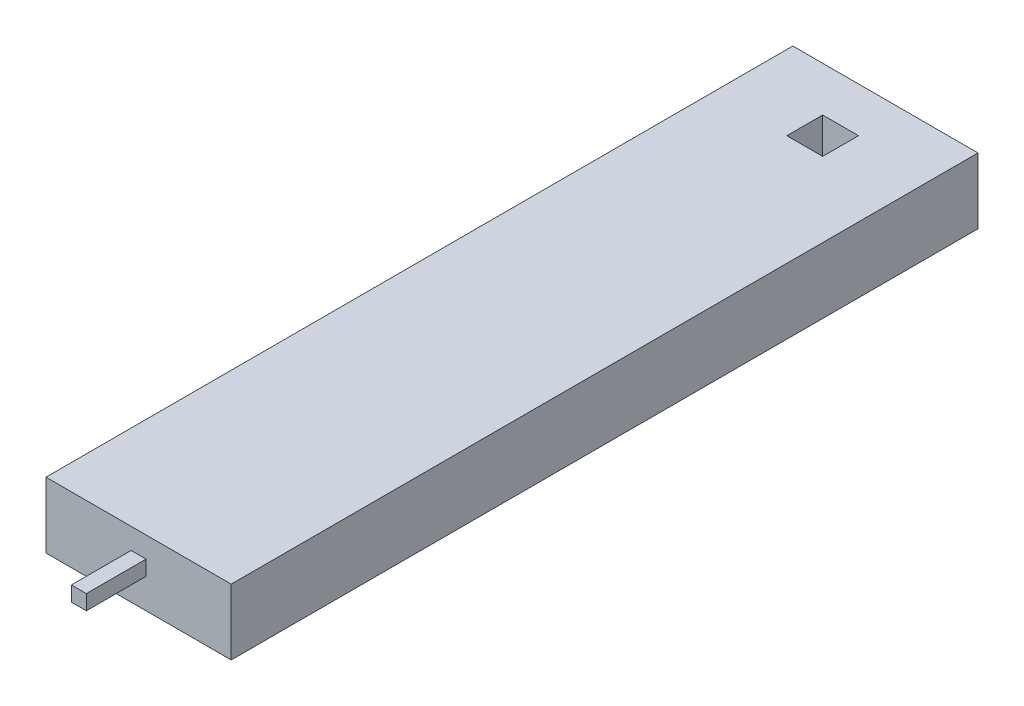
ISO-10303-21;
HEADER;
FILE_DESCRIPTION(('STEP AP214'),'2;1');
FILE_NAME('part.step','',(''),(''),'','','');
FILE_SCHEMA(('AUTOMOTIVE_DESIGN { 1 0 10303 214 1 1 1 1 }'));
ENDSEC;
DATA;
#1=APPLICATION_CONTEXT('core data for automotive mechanical design processes');
#2=APPLICATION_PROTOCOL_DEFINITION('international standard','automotive_design',2000,#1);
#3=PRODUCT_CONTEXT('',#1,'mechanical');
#4=PRODUCT('Part','Part','',(#3));
#5=PRODUCT_RELATED_PRODUCT_CATEGORY('part','',(#4));
#6=PRODUCT_DEFINITION_FORMATION('','',#4);
#7=PRODUCT_DEFINITION_CONTEXT('part definition',#1,'design');
#8=PRODUCT_DEFINITION('design','',#6,#7);
#9=PRODUCT_DEFINITION_SHAPE('','',#8);
#10=(LENGTH_UNIT() NAMED_UNIT(*) SI_UNIT(.MILLI.,.METRE.));
#11=(NAMED_UNIT(*) PLANE_ANGLE_UNIT() SI_UNIT($,.RADIAN.));
#12=(NAMED_UNIT(*) SI_UNIT($,.STERADIAN.) SOLID_ANGLE_UNIT());
#13=UNCERTAINTY_MEASURE_WITH_UNIT(LENGTH_MEASURE(1.E-05),#10,'distance_accuracy_value','');
#14=(GEOMETRIC_REPRESENTATION_CONTEXT(3) GLOBAL_UNCERTAINTY_ASSIGNED_CONTEXT((#13)) GLOBAL_UNIT_ASSIGNED_CONTEXT((#10,
#11,#12)) REPRESENTATION_CONTEXT('',''));
#15=CARTESIAN_POINT('',(0.,0.,0.));
#16=DIRECTION('',(0.,0.,1.));
#17=DIRECTION('',(1.,0.,0.));
#18=AXIS2_PLACEMENT_3D('',#15,#16,#17);
#19=CARTESIAN_POINT('',(0.,0.,200.));
#20=DIRECTION('',(0.,0.,1.));
#21=DIRECTION('',(1.,0.,0.));
#22=AXIS2_PLACEMENT_3D('',#19,#20,#21);
#23=PLANE('',#22);
#24=DIRECTION('',(0.,-1.,0.));
#25=VECTOR('',#24,1.);
#26=CARTESIAN_POINT('',(31.,0.,200.));
#27=LINE('',#26,#25);
#28=CARTESIAN_POINT('',(31.,21.,200.));
#29=VERTEX_POINT('',#28);
#30=CARTESIAN_POINT('',(31.,-1.,200.));
#31=VERTEX_POINT('',#30);
#32=EDGE_CURVE('E232',#29,#31,#27,.T.);
#33=ORIENTED_EDGE('',*,*,#32,.F.);
#34=DIRECTION('',(-1.,0.,0.));
#35=VECTOR('',#34,1.);
#36=CARTESIAN_POINT('',(0.,21.,200.));
#37=LINE('',#36,#35);
#38=CARTESIAN_POINT('',(-31.,21.,200.));
#39=VERTEX_POINT('',#38);
#40=EDGE_CURVE('E235',#29,#39,#37,.T.);
#41=ORIENTED_EDGE('',*,*,#40,.T.);
#42=DIRECTION('',(0.,-1.,0.));
#43=VECTOR('',#42,1.);
#44=CARTESIAN_POINT('',(-31.,0.,200.));
#45=LINE('',#44,#43);
#46=CARTESIAN_POINT('',(-31.,-1.,200.));
#47=VERTEX_POINT('',#46);
#48=EDGE_CURVE('E240',#39,#47,#45,.T.);
#49=ORIENTED_EDGE('',*,*,#48,.T.);
#50=DIRECTION('',(-1.,0.,0.));
#51=VECTOR('',#50,1.);
#52=CARTESIAN_POINT('',(0.,-1.,200.));
#53=LINE('',#52,#51);
#54=EDGE_CURVE('E225',#31,#47,#53,.T.);
#55=ORIENTED_EDGE('',*,*,#54,.F.);
#56=EDGE_LOOP('',(#33,#41,#49,#55));
#57=FACE_BOUND('',#56,.T.);
#58=DIRECTION('',(1.,0.,0.));
#59=VECTOR('',#58,1.);
#60=CARTESIAN_POINT('',(-2.5,9.,200.));
#61=LINE('',#60,#59);
#62=CARTESIAN_POINT('',(-2.5,9.,200.));
#63=VERTEX_POINT('',#62);
#64=CARTESIAN_POINT('',(2.5,9.,200.));
#65=VERTEX_POINT('',#64);
#66=EDGE_CURVE('E203',#63,#65,#61,.T.);
#67=ORIENTED_EDGE('',*,*,#66,.F.);
#68=DIRECTION('',(0.,-1.,0.));
#69=VECTOR('',#68,1.);
#70=CARTESIAN_POINT('',(-2.5,14.,200.));
#71=LINE('',#70,#69);
#72=CARTESIAN_POINT('',(-2.5,14.,200.));
#73=VERTEX_POINT('',#72);
#74=EDGE_CURVE('E184',#73,#63,#71,.T.);
#75=ORIENTED_EDGE('',*,*,#74,.F.);
#76=DIRECTION('',(-1.,0.,0.));
#77=VECTOR('',#76,1.);
#78=CARTESIAN_POINT('',(-2.5,14.,200.));
#79=LINE('',#78,#77);
#80=CARTESIAN_POINT('',(2.5,14.,200.));
#81=VERTEX_POINT('',#80);
#82=EDGE_CURVE('E190',#81,#73,#79,.T.);
#83=ORIENTED_EDGE('',*,*,#82,.F.);
#84=DIRECTION('',(0.,1.,0.));
#85=VECTOR('',#84,1.);
#86=CARTESIAN_POINT('',(2.5,14.,200.));
#87=LINE('',#86,#85);
#88=EDGE_CURVE('E206',#65,#81,#87,.T.);
#89=ORIENTED_EDGE('',*,*,#88,.F.);
#90=EDGE_LOOP('',(#67,#75,#83,#89));
#91=FACE_BOUND('',#90,.T.);
#92=ADVANCED_FACE('F45',(#57,#91),#23,.T.);
#93=CARTESIAN_POINT('',(0.,21.,200.));
#94=DIRECTION('',(0.,-1.,0.));
#95=DIRECTION('',(0.,0.,-1.));
#96=AXIS2_PLACEMENT_3D('',#93,#94,#95);
#97=PLANE('',#96);
#98=DIRECTION('',(1.,0.,0.));
#99=VECTOR('',#98,1.);
#100=CARTESIAN_POINT('',(-6.00000000000001,21.,-23.));
#101=LINE('',#100,#99);
#102=CARTESIAN_POINT('',(-6.00000000000001,21.,-23.));
#103=VERTEX_POINT('',#102);
#104=CARTESIAN_POINT('',(6.00000000000001,21.,-23.));
#105=VERTEX_POINT('',#104);
#106=EDGE_CURVE('E146',#103,#105,#101,.T.);
#107=ORIENTED_EDGE('',*,*,#106,.F.);
#108=DIRECTION('',(0.,0.,1.));
#109=VECTOR('',#108,1.);
#110=CARTESIAN_POINT('',(-6.00000000000001,21.,-35.));
#111=LINE('',#110,#109);
#112=CARTESIAN_POINT('',(-6.00000000000001,21.,-35.));
#113=VERTEX_POINT('',#112);
#114=EDGE_CURVE('E60',#113,#103,#111,.T.);
#115=ORIENTED_EDGE('',*,*,#114,.F.);
#116=DIRECTION('',(-1.,0.,0.));
#117=VECTOR('',#116,1.);
#118=CARTESIAN_POINT('',(-6.00000000000001,21.,-35.));
#119=LINE('',#118,#117);
#120=CARTESIAN_POINT('',(6.00000000000001,21.,-35.));
#121=VERTEX_POINT('',#120);
#122=EDGE_CURVE('E154',#121,#113,#119,.T.);
#123=ORIENTED_EDGE('',*,*,#122,.F.);
#124=DIRECTION('',(0.,0.,-1.));
#125=VECTOR('',#124,1.);
#126=CARTESIAN_POINT('',(6.00000000000001,21.,-35.));
#127=LINE('',#126,#125);
#128=EDGE_CURVE('E136',#105,#121,#127,.T.);
#129=ORIENTED_EDGE('',*,*,#128,.F.);
#130=EDGE_LOOP('',(#107,#115,#123,#129));
#131=FACE_BOUND('',#130,.T.);
#132=DIRECTION('',(0.,0.,-1.));
#133=VECTOR('',#132,1.);
#134=CARTESIAN_POINT('',(31.,21.,200.));
#135=LINE('',#134,#133);
#136=CARTESIAN_POINT('',(31.,21.,-50.));
#137=VERTEX_POINT('',#136);
#138=EDGE_CURVE('E244',#29,#137,#135,.T.);
#139=ORIENTED_EDGE('',*,*,#138,.T.);
#140=DIRECTION('',(1.,0.,0.));
#141=VECTOR('',#140,1.);
#142=CARTESIAN_POINT('',(31.,21.,-50.));
#143=LINE('',#142,#141);
#144=CARTESIAN_POINT('',(-31.,21.,-50.));
#145=VERTEX_POINT('',#144);
#146=EDGE_CURVE('E180',#145,#137,#143,.T.);
#147=ORIENTED_EDGE('',*,*,#146,.F.);
#148=DIRECTION('',(0.,0.,-1.));
#149=VECTOR('',#148,1.);
#150=CARTESIAN_POINT('',(-31.,21.,200.));
#151=LINE('',#150,#149);
#152=EDGE_CURVE('E248',#39,#145,#151,.T.);
#153=ORIENTED_EDGE('',*,*,#152,.F.);
#154=ORIENTED_EDGE('',*,*,#40,.F.);
#155=EDGE_LOOP('',(#139,#147,#153,#154));
#156=FACE_BOUND('',#155,.T.);
#157=ADVANCED_FACE('F151',(#131,#156),#97,.F.);
#158=CARTESIAN_POINT('',(31.,0.,200.));
#159=DIRECTION('',(1.,0.,0.));
#160=DIRECTION('',(0.,0.,-1.));
#161=AXIS2_PLACEMENT_3D('',#158,#159,#160);
#162=PLANE('',#161);
#163=DIRECTION('',(0.,0.,-1.));
#164=VECTOR('',#163,1.);
#165=CARTESIAN_POINT('',(31.,-1.,200.));
#166=LINE('',#165,#164);
#167=CARTESIAN_POINT('',(31.,-1.,-50.));
#168=VERTEX_POINT('',#167);
#169=EDGE_CURVE('E228',#31,#168,#166,.T.);
#170=ORIENTED_EDGE('',*,*,#169,.T.);
#171=DIRECTION('',(0.,-1.,0.));
#172=VECTOR('',#171,1.);
#173=CARTESIAN_POINT('',(31.,21.,-50.));
#174=LINE('',#173,#172);
#175=EDGE_CURVE('E164',#137,#168,#174,.T.);
#176=ORIENTED_EDGE('',*,*,#175,.F.);
#177=ORIENTED_EDGE('',*,*,#138,.F.);
#178=ORIENTED_EDGE('',*,*,#32,.T.);
#179=EDGE_LOOP('',(#170,#176,#177,#178));
#180=FACE_BOUND('',#179,.T.);
#181=ADVANCED_FACE('F285',(#180),#162,.T.);
#182=CARTESIAN_POINT('',(-31.,0.,200.));
#183=DIRECTION('',(1.,0.,0.));
#184=DIRECTION('',(0.,0.,-1.));
#185=AXIS2_PLACEMENT_3D('',#182,#183,#184);
#186=PLANE('',#185);
#187=ORIENTED_EDGE('',*,*,#152,.T.);
#188=DIRECTION('',(0.,1.,0.));
#189=VECTOR('',#188,1.);
#190=CARTESIAN_POINT('',(-31.,21.,-50.));
#191=LINE('',#190,#189);
#192=CARTESIAN_POINT('',(-31.,-1.,-50.));
#193=VERTEX_POINT('',#192);
#194=EDGE_CURVE('E176',#193,#145,#191,.T.);
#195=ORIENTED_EDGE('',*,*,#194,.F.);
#196=DIRECTION('',(0.,0.,-1.));
#197=VECTOR('',#196,1.);
#198=CARTESIAN_POINT('',(-31.,-1.,200.));
#199=LINE('',#198,#197);
#200=EDGE_CURVE('E229',#47,#193,#199,.T.);
#201=ORIENTED_EDGE('',*,*,#200,.F.);
#202=ORIENTED_EDGE('',*,*,#48,.F.);
#203=EDGE_LOOP('',(#187,#195,#201,#202));
#204=FACE_BOUND('',#203,.T.);
#205=ADVANCED_FACE('F290',(#204),#186,.F.);
#206=CARTESIAN_POINT('',(0.,-1.,200.));
#207=DIRECTION('',(0.,-1.,0.));
#208=DIRECTION('',(0.,0.,-1.));
#209=AXIS2_PLACEMENT_3D('',#206,#207,#208);
#210=PLANE('',#209);
#211=DIRECTION('',(0.,0.,-1.));
#212=VECTOR('',#211,1.);
#213=CARTESIAN_POINT('',(-6.00000000000001,-1.,200.));
#214=LINE('',#213,#212);
#215=CARTESIAN_POINT('',(-6.00000000000001,-1.,-23.));
#216=VERTEX_POINT('',#215);
#217=CARTESIAN_POINT('',(-6.00000000000001,-1.,-35.));
#218=VERTEX_POINT('',#217);
#219=EDGE_CURVE('E11',#216,#218,#214,.T.);
#220=ORIENTED_EDGE('',*,*,#219,.F.);
#221=DIRECTION('',(-1.,0.,0.));
#222=VECTOR('',#221,1.);
#223=CARTESIAN_POINT('',(0.,-1.,-23.));
#224=LINE('',#223,#222);
#225=CARTESIAN_POINT('',(6.00000000000001,-1.,-23.));
#226=VERTEX_POINT('',#225);
#227=EDGE_CURVE('E239',#226,#216,#224,.T.);
#228=ORIENTED_EDGE('',*,*,#227,.F.);
#229=DIRECTION('',(0.,0.,1.));
#230=VECTOR('',#229,1.);
#231=CARTESIAN_POINT('',(6.00000000000001,-1.,200.));
#232=LINE('',#231,#230);
#233=CARTESIAN_POINT('',(6.00000000000001,-1.,-35.));
#234=VERTEX_POINT('',#233);
#235=EDGE_CURVE('E139',#234,#226,#232,.T.);
#236=ORIENTED_EDGE('',*,*,#235,.F.);
#237=DIRECTION('',(1.,0.,0.));
#238=VECTOR('',#237,1.);
#239=CARTESIAN_POINT('',(0.,-1.,-35.));
#240=LINE('',#239,#238);
#241=EDGE_CURVE('E53',#218,#234,#240,.T.);
#242=ORIENTED_EDGE('',*,*,#241,.F.);
#243=EDGE_LOOP('',(#220,#228,#236,#242));
#244=FACE_BOUND('',#243,.T.);
#245=ORIENTED_EDGE('',*,*,#200,.T.);
#246=DIRECTION('',(-1.,0.,0.));
#247=VECTOR('',#246,1.);
#248=CARTESIAN_POINT('',(31.,-1.,-50.));
#249=LINE('',#248,#247);
#250=EDGE_CURVE('E172',#168,#193,#249,.T.);
#251=ORIENTED_EDGE('',*,*,#250,.F.);
#252=ORIENTED_EDGE('',*,*,#169,.F.);
#253=ORIENTED_EDGE('',*,*,#54,.T.);
#254=EDGE_LOOP('',(#245,#251,#252,#253));
#255=FACE_BOUND('',#254,.T.);
#256=ADVANCED_FACE('F263',(#244,#255),#210,.T.);
#257=CARTESIAN_POINT('',(-2.5,14.,220.));
#258=DIRECTION('',(1.,0.,0.));
#259=DIRECTION('',(0.,1.,0.));
#260=AXIS2_PLACEMENT_3D('',#257,#258,#259);
#261=PLANE('',#260);
#262=ORIENTED_EDGE('',*,*,#74,.T.);
#263=DIRECTION('',(0.,0.,-1.));
#264=VECTOR('',#263,1.);
#265=CARTESIAN_POINT('',(-2.5,9.,220.));
#266=LINE('',#265,#264);
#267=CARTESIAN_POINT('',(-2.5,9.,220.));
#268=VERTEX_POINT('',#267);
#269=EDGE_CURVE('E222',#268,#63,#266,.T.);
#270=ORIENTED_EDGE('',*,*,#269,.F.);
#271=DIRECTION('',(0.,-1.,0.));
#272=VECTOR('',#271,1.);
#273=CARTESIAN_POINT('',(-2.5,14.,220.));
#274=LINE('',#273,#272);
#275=CARTESIAN_POINT('',(-2.5,14.,220.));
#276=VERTEX_POINT('',#275);
#277=EDGE_CURVE('E185',#276,#268,#274,.T.);
#278=ORIENTED_EDGE('',*,*,#277,.F.);
#279=DIRECTION('',(0.,0.,-1.));
#280=VECTOR('',#279,1.);
#281=CARTESIAN_POINT('',(-2.5,14.,220.));
#282=LINE('',#281,#280);
#283=EDGE_CURVE('E199',#276,#73,#282,.T.);
#284=ORIENTED_EDGE('',*,*,#283,.T.);
#285=EDGE_LOOP('',(#262,#270,#278,#284));
#286=FACE_BOUND('',#285,.T.);
#287=ADVANCED_FACE('F286',(#286),#261,.F.);
#288=CARTESIAN_POINT('',(-2.5,9.,220.));
#289=DIRECTION('',(0.,1.,0.));
#290=DIRECTION('',(0.,0.,1.));
#291=AXIS2_PLACEMENT_3D('',#288,#289,#290);
#292=PLANE('',#291);
#293=ORIENTED_EDGE('',*,*,#66,.T.);
#294=DIRECTION('',(0.,0.,-1.));
#295=VECTOR('',#294,1.);
#296=CARTESIAN_POINT('',(2.5,9.,220.));
#297=LINE('',#296,#295);
#298=CARTESIAN_POINT('',(2.5,9.,220.));
#299=VERTEX_POINT('',#298);
#300=EDGE_CURVE('E218',#299,#65,#297,.T.);
#301=ORIENTED_EDGE('',*,*,#300,.F.);
#302=DIRECTION('',(1.,0.,0.));
#303=VECTOR('',#302,1.);
#304=CARTESIAN_POINT('',(-2.5,9.,220.));
#305=LINE('',#304,#303);
#306=EDGE_CURVE('E189',#268,#299,#305,.T.);
#307=ORIENTED_EDGE('',*,*,#306,.F.);
#308=ORIENTED_EDGE('',*,*,#269,.T.);
#309=EDGE_LOOP('',(#293,#301,#307,#308));
#310=FACE_BOUND('',#309,.T.);
#311=ADVANCED_FACE('F296',(#310),#292,.F.);
#312=CARTESIAN_POINT('',(2.5,14.,220.));
#313=DIRECTION('',(-1.,0.,0.));
#314=DIRECTION('',(0.,-1.,0.));
#315=AXIS2_PLACEMENT_3D('',#312,#313,#314);
#316=PLANE('',#315);
#317=ORIENTED_EDGE('',*,*,#88,.T.);
#318=DIRECTION('',(0.,0.,-1.));
#319=VECTOR('',#318,1.);
#320=CARTESIAN_POINT('',(2.5,14.,220.));
#321=LINE('',#320,#319);
#322=CARTESIAN_POINT('',(2.5,14.,220.));
#323=VERTEX_POINT('',#322);
#324=EDGE_CURVE('E215',#323,#81,#321,.T.);
#325=ORIENTED_EDGE('',*,*,#324,.F.);
#326=DIRECTION('',(0.,1.,0.));
#327=VECTOR('',#326,1.);
#328=CARTESIAN_POINT('',(2.5,14.,220.));
#329=LINE('',#328,#327);
#330=EDGE_CURVE('E193',#299,#323,#329,.T.);
#331=ORIENTED_EDGE('',*,*,#330,.F.);
#332=ORIENTED_EDGE('',*,*,#300,.T.);
#333=EDGE_LOOP('',(#317,#325,#331,#332));
#334=FACE_BOUND('',#333,.T.);
#335=ADVANCED_FACE('F393',(#334),#316,.F.);
#336=CARTESIAN_POINT('',(-2.5,14.,220.));
#337=DIRECTION('',(0.,-1.,0.));
#338=DIRECTION('',(0.,0.,-1.));
#339=AXIS2_PLACEMENT_3D('',#336,#337,#338);
#340=PLANE('',#339);
#341=ORIENTED_EDGE('',*,*,#82,.T.);
#342=ORIENTED_EDGE('',*,*,#283,.F.);
#343=DIRECTION('',(-1.,0.,0.));
#344=VECTOR('',#343,1.);
#345=CARTESIAN_POINT('',(-2.5,14.,220.));
#346=LINE('',#345,#344);
#347=EDGE_CURVE('E196',#323,#276,#346,.T.);
#348=ORIENTED_EDGE('',*,*,#347,.F.);
#349=ORIENTED_EDGE('',*,*,#324,.T.);
#350=EDGE_LOOP('',(#341,#342,#348,#349));
#351=FACE_BOUND('',#350,.T.);
#352=ADVANCED_FACE('F384',(#351),#340,.F.);
#353=CARTESIAN_POINT('',(0.,0.,220.));
#354=DIRECTION('',(0.,0.,1.));
#355=DIRECTION('',(1.,0.,0.));
#356=AXIS2_PLACEMENT_3D('',#353,#354,#355);
#357=PLANE('',#356);
#358=ORIENTED_EDGE('',*,*,#277,.T.);
#359=ORIENTED_EDGE('',*,*,#306,.T.);
#360=ORIENTED_EDGE('',*,*,#330,.T.);
#361=ORIENTED_EDGE('',*,*,#347,.T.);
#362=EDGE_LOOP('',(#358,#359,#360,#361));
#363=FACE_BOUND('',#362,.T.);
#364=ADVANCED_FACE('F275',(#363),#357,.T.);
#365=CARTESIAN_POINT('',(0.,0.,-50.));
#366=DIRECTION('',(0.,0.,-1.));
#367=DIRECTION('',(-1.,0.,0.));
#368=AXIS2_PLACEMENT_3D('',#365,#366,#367);
#369=PLANE('',#368);
#370=ORIENTED_EDGE('',*,*,#175,.T.);
#371=ORIENTED_EDGE('',*,*,#250,.T.);
#372=ORIENTED_EDGE('',*,*,#194,.T.);
#373=ORIENTED_EDGE('',*,*,#146,.T.);
#374=EDGE_LOOP('',(#370,#371,#372,#373));
#375=FACE_BOUND('',#374,.T.);
#376=ADVANCED_FACE('F268',(#375),#369,.T.);
#377=CARTESIAN_POINT('',(-6.00000000000001,-79.,-35.));
#378=DIRECTION('',(-1.,0.,0.));
#379=DIRECTION('',(0.,0.,1.));
#380=AXIS2_PLACEMENT_3D('',#377,#378,#379);
#381=PLANE('',#380);
#382=ORIENTED_EDGE('',*,*,#219,.T.);
#383=DIRECTION('',(0.,1.,0.));
#384=VECTOR('',#383,1.);
#385=CARTESIAN_POINT('',(-6.00000000000001,-79.,-35.));
#386=LINE('',#385,#384);
#387=EDGE_CURVE('E161',#218,#113,#386,.T.);
#388=ORIENTED_EDGE('',*,*,#387,.T.);
#389=ORIENTED_EDGE('',*,*,#114,.T.);
#390=DIRECTION('',(0.,1.,0.));
#391=VECTOR('',#390,1.);
#392=CARTESIAN_POINT('',(-6.00000000000001,-79.,-23.));
#393=LINE('',#392,#391);
#394=EDGE_CURVE('E143',#216,#103,#393,.T.);
#395=ORIENTED_EDGE('',*,*,#394,.F.);
#396=EDGE_LOOP('',(#382,#388,#389,#395));
#397=FACE_BOUND('',#396,.T.);
#398=ADVANCED_FACE('F265',(#397),#381,.F.);
#399=CARTESIAN_POINT('',(-6.00000000000001,-79.,-35.));
#400=DIRECTION('',(0.,0.,-1.));
#401=DIRECTION('',(-1.,0.,0.));
#402=AXIS2_PLACEMENT_3D('',#399,#400,#401);
#403=PLANE('',#402);
#404=ORIENTED_EDGE('',*,*,#241,.T.);
#405=DIRECTION('',(0.,1.,0.));
#406=VECTOR('',#405,1.);
#407=CARTESIAN_POINT('',(6.00000000000001,-79.,-35.));
#408=LINE('',#407,#406);
#409=EDGE_CURVE('E142',#234,#121,#408,.T.);
#410=ORIENTED_EDGE('',*,*,#409,.T.);
#411=ORIENTED_EDGE('',*,*,#122,.T.);
#412=ORIENTED_EDGE('',*,*,#387,.F.);
#413=EDGE_LOOP('',(#404,#410,#411,#412));
#414=FACE_BOUND('',#413,.T.);
#415=ADVANCED_FACE('F260',(#414),#403,.F.);
#416=CARTESIAN_POINT('',(6.00000000000001,-79.,-35.));
#417=DIRECTION('',(1.,0.,0.));
#418=DIRECTION('',(0.,0.,-1.));
#419=AXIS2_PLACEMENT_3D('',#416,#417,#418);
#420=PLANE('',#419);
#421=ORIENTED_EDGE('',*,*,#235,.T.);
#422=DIRECTION('',(0.,1.,0.));
#423=VECTOR('',#422,1.);
#424=CARTESIAN_POINT('',(6.00000000000001,-79.,-23.));
#425=LINE('',#424,#423);
#426=EDGE_CURVE('E68',#226,#105,#425,.T.);
#427=ORIENTED_EDGE('',*,*,#426,.T.);
#428=ORIENTED_EDGE('',*,*,#128,.T.);
#429=ORIENTED_EDGE('',*,*,#409,.F.);
#430=EDGE_LOOP('',(#421,#427,#428,#429));
#431=FACE_BOUND('',#430,.T.);
#432=ADVANCED_FACE('F133',(#431),#420,.F.);
#433=CARTESIAN_POINT('',(-6.00000000000001,-79.,-23.));
#434=DIRECTION('',(0.,0.,1.));
#435=DIRECTION('',(1.,0.,0.));
#436=AXIS2_PLACEMENT_3D('',#433,#434,#435);
#437=PLANE('',#436);
#438=ORIENTED_EDGE('',*,*,#227,.T.);
#439=ORIENTED_EDGE('',*,*,#394,.T.);
#440=ORIENTED_EDGE('',*,*,#106,.T.);
#441=ORIENTED_EDGE('',*,*,#426,.F.);
#442=EDGE_LOOP('',(#438,#439,#440,#441));
#443=FACE_BOUND('',#442,.T.);
#444=ADVANCED_FACE('F147',(#443),#437,.F.);
#445=CLOSED_SHELL('',(#92,#157,#181,#205,#256,#287,#311,#335,#352,#364,#376,#398,#415,#432,#444));
#446=MANIFOLD_SOLID_BREP('B2',#445);
#447=ADVANCED_BREP_SHAPE_REPRESENTATION('',(#18,#446),#14);
#448=SHAPE_DEFINITION_REPRESENTATION(#9,#447);
ENDSEC;
END-ISO-10303-21;
